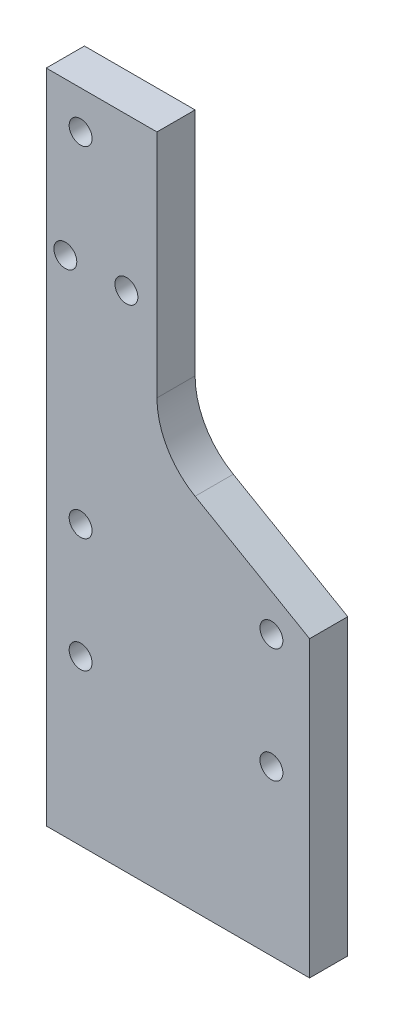
ISO-10303-21;
HEADER;
FILE_DESCRIPTION(('STEP AP214'),'2;1');
FILE_NAME('part.step','',(''),(''),'','','');
FILE_SCHEMA(('AUTOMOTIVE_DESIGN { 1 0 10303 214 1 1 1 1 }'));
ENDSEC;
DATA;
#1=APPLICATION_CONTEXT('core data for automotive mechanical design processes');
#2=APPLICATION_PROTOCOL_DEFINITION('international standard','automotive_design',2000,#1);
#3=PRODUCT_CONTEXT('',#1,'mechanical');
#4=PRODUCT('Part','Part','',(#3));
#5=PRODUCT_RELATED_PRODUCT_CATEGORY('part','',(#4));
#6=PRODUCT_DEFINITION_FORMATION('','',#4);
#7=PRODUCT_DEFINITION_CONTEXT('part definition',#1,'design');
#8=PRODUCT_DEFINITION('design','',#6,#7);
#9=PRODUCT_DEFINITION_SHAPE('','',#8);
#10=(LENGTH_UNIT() NAMED_UNIT(*) SI_UNIT(.MILLI.,.METRE.));
#11=(NAMED_UNIT(*) PLANE_ANGLE_UNIT() SI_UNIT($,.RADIAN.));
#12=(NAMED_UNIT(*) SI_UNIT($,.STERADIAN.) SOLID_ANGLE_UNIT());
#13=UNCERTAINTY_MEASURE_WITH_UNIT(LENGTH_MEASURE(1.E-05),#10,'distance_accuracy_value','');
#14=(GEOMETRIC_REPRESENTATION_CONTEXT(3) GLOBAL_UNCERTAINTY_ASSIGNED_CONTEXT((#13)) GLOBAL_UNIT_ASSIGNED_CONTEXT((#10,
#11,#12)) REPRESENTATION_CONTEXT('',''));
#15=CARTESIAN_POINT('',(0.,0.,0.));
#16=DIRECTION('',(0.,0.,1.));
#17=DIRECTION('',(1.,0.,0.));
#18=AXIS2_PLACEMENT_3D('',#15,#16,#17);
#19=CARTESIAN_POINT('',(-20.,128.641016151377,10.));
#20=DIRECTION('',(0.,0.,1.));
#21=DIRECTION('',(1.,0.,0.));
#22=AXIS2_PLACEMENT_3D('',#19,#20,#21);
#23=PLANE('',#22);
#24=DIRECTION('',(-1.,0.,0.));
#25=VECTOR('',#24,1.);
#26=CARTESIAN_POINT('',(-69.0000000000001,17.,10.0000000000001));
#27=LINE('',#26,#25);
#28=CARTESIAN_POINT('',(0.,17.,10.0000000000002));
#29=VERTEX_POINT('',#28);
#30=CARTESIAN_POINT('',(-69.0000000000001,17.,10.0000000000001));
#31=VERTEX_POINT('',#30);
#32=EDGE_CURVE('E47',#29,#31,#27,.T.);
#33=ORIENTED_EDGE('',*,*,#32,.F.);
#34=DIRECTION('',(0.,1.,0.));
#35=VECTOR('',#34,1.);
#36=CARTESIAN_POINT('',(0.,94.,10.0000000000002));
#37=LINE('',#36,#35);
#38=CARTESIAN_POINT('',(0.,94.,10.0000000000002));
#39=VERTEX_POINT('',#38);
#40=EDGE_CURVE('E87',#29,#39,#37,.T.);
#41=ORIENTED_EDGE('',*,*,#40,.T.);
#42=DIRECTION('',(-0.866025403784441,0.499999999999998,0.));
#43=VECTOR('',#42,1.);
#44=CARTESIAN_POINT('',(-29.9999999999999,111.320508075689,10.0000000000002));
#45=LINE('',#44,#43);
#46=CARTESIAN_POINT('',(-30.,111.320508075689,10.0000000000002));
#47=VERTEX_POINT('',#46);
#48=EDGE_CURVE('E101',#39,#47,#45,.T.);
#49=ORIENTED_EDGE('',*,*,#48,.T.);
#50=CARTESIAN_POINT('',(-20.,128.641016151377,10.));
#51=DIRECTION('',(0.,0.,-1.));
#52=DIRECTION('',(1.,0.,0.));
#53=AXIS2_PLACEMENT_3D('',#50,#51,#52);
#54=CIRCLE('',#53,20.);
#55=CARTESIAN_POINT('',(-39.9999999999998,128.641016151377,10.0000000000001));
#56=VERTEX_POINT('',#55);
#57=EDGE_CURVE('E95',#47,#56,#54,.T.);
#58=ORIENTED_EDGE('',*,*,#57,.T.);
#59=DIRECTION('',(0.,1.,0.));
#60=VECTOR('',#59,1.);
#61=CARTESIAN_POINT('',(-39.9999999999998,189.,10.0000000000001));
#62=LINE('',#61,#60);
#63=CARTESIAN_POINT('',(-39.9999999999998,189.,10.0000000000001));
#64=VERTEX_POINT('',#63);
#65=EDGE_CURVE('E99',#56,#64,#62,.T.);
#66=ORIENTED_EDGE('',*,*,#65,.T.);
#67=DIRECTION('',(-1.,0.,0.));
#68=VECTOR('',#67,1.);
#69=CARTESIAN_POINT('',(-69.0000000000001,189.,10.0000000000001));
#70=LINE('',#69,#68);
#71=CARTESIAN_POINT('',(-69.0000000000001,189.,10.0000000000001));
#72=VERTEX_POINT('',#71);
#73=EDGE_CURVE('E56',#64,#72,#70,.T.);
#74=ORIENTED_EDGE('',*,*,#73,.T.);
#75=DIRECTION('',(0.,-1.,0.));
#76=VECTOR('',#75,1.);
#77=CARTESIAN_POINT('',(-69.0000000000001,0.,10.0000000000001));
#78=LINE('',#77,#76);
#79=EDGE_CURVE('E117',#72,#31,#78,.T.);
#80=ORIENTED_EDGE('',*,*,#79,.T.);
#81=EDGE_LOOP('',(#33,#41,#49,#58,#66,#74,#80));
#82=FACE_BOUND('',#81,.T.);
#83=CARTESIAN_POINT('',(-48.,149.,10.0000000000001));
#84=DIRECTION('',(0.,0.,1.));
#85=DIRECTION('',(1.,0.,0.));
#86=AXIS2_PLACEMENT_3D('',#83,#84,#85);
#87=CIRCLE('',#86,3.);
#88=CARTESIAN_POINT('',(-45.,149.,10.0000000000001));
#89=VERTEX_POINT('',#88);
#90=EDGE_CURVE('E184',#89,#89,#87,.T.);
#91=ORIENTED_EDGE('',*,*,#90,.F.);
#92=EDGE_LOOP('',(#91));
#93=FACE_BOUND('',#92,.T.);
#94=CARTESIAN_POINT('',(-10.,90.,9.99999999999995));
#95=DIRECTION('',(0.,0.,1.));
#96=DIRECTION('',(1.,0.,0.));
#97=AXIS2_PLACEMENT_3D('',#94,#95,#96);
#98=CIRCLE('',#97,3.);
#99=CARTESIAN_POINT('',(-7.00000000000001,90.,9.99999999999995));
#100=VERTEX_POINT('',#99);
#101=EDGE_CURVE('E172',#100,#100,#98,.T.);
#102=ORIENTED_EDGE('',*,*,#101,.F.);
#103=EDGE_LOOP('',(#102));
#104=FACE_BOUND('',#103,.T.);
#105=CARTESIAN_POINT('',(-10.,59.9999999999999,9.99999999999995));
#106=DIRECTION('',(0.,0.,1.));
#107=DIRECTION('',(1.,0.,0.));
#108=AXIS2_PLACEMENT_3D('',#105,#106,#107);
#109=CIRCLE('',#108,3.);
#110=CARTESIAN_POINT('',(-7.00000000000001,59.9999999999999,9.99999999999995));
#111=VERTEX_POINT('',#110);
#112=EDGE_CURVE('E160',#111,#111,#109,.T.);
#113=ORIENTED_EDGE('',*,*,#112,.F.);
#114=EDGE_LOOP('',(#113));
#115=FACE_BOUND('',#114,.T.);
#116=CARTESIAN_POINT('',(-59.9999999999999,59.9999999999999,10.0000000000002));
#117=DIRECTION('',(0.,0.,1.));
#118=DIRECTION('',(1.,0.,0.));
#119=AXIS2_PLACEMENT_3D('',#116,#117,#118);
#120=CIRCLE('',#119,3.);
#121=CARTESIAN_POINT('',(-56.9999999999999,59.9999999999999,10.0000000000002));
#122=VERTEX_POINT('',#121);
#123=EDGE_CURVE('E126',#122,#122,#120,.T.);
#124=ORIENTED_EDGE('',*,*,#123,.F.);
#125=EDGE_LOOP('',(#124));
#126=FACE_BOUND('',#125,.T.);
#127=CARTESIAN_POINT('',(-59.9999999999999,90.,10.0000000000002));
#128=DIRECTION('',(0.,0.,1.));
#129=DIRECTION('',(1.,0.,0.));
#130=AXIS2_PLACEMENT_3D('',#127,#128,#129);
#131=CIRCLE('',#130,3.);
#132=CARTESIAN_POINT('',(-56.9999999999999,90.,10.0000000000002));
#133=VERTEX_POINT('',#132);
#134=EDGE_CURVE('E166',#133,#133,#131,.T.);
#135=ORIENTED_EDGE('',*,*,#134,.F.);
#136=EDGE_LOOP('',(#135));
#137=FACE_BOUND('',#136,.T.);
#138=CARTESIAN_POINT('',(-64.,149.,10.));
#139=DIRECTION('',(0.,0.,1.));
#140=DIRECTION('',(1.,0.,0.));
#141=AXIS2_PLACEMENT_3D('',#138,#139,#140);
#142=CIRCLE('',#141,3.);
#143=CARTESIAN_POINT('',(-61.,149.,10.));
#144=VERTEX_POINT('',#143);
#145=EDGE_CURVE('E178',#144,#144,#142,.T.);
#146=ORIENTED_EDGE('',*,*,#145,.F.);
#147=EDGE_LOOP('',(#146));
#148=FACE_BOUND('',#147,.T.);
#149=CARTESIAN_POINT('',(-59.9999999999999,179.,10.0000000000002));
#150=DIRECTION('',(0.,0.,1.));
#151=DIRECTION('',(1.,0.,0.));
#152=AXIS2_PLACEMENT_3D('',#149,#150,#151);
#153=CIRCLE('',#152,3.);
#154=CARTESIAN_POINT('',(-56.9999999999999,179.,10.0000000000002));
#155=VERTEX_POINT('',#154);
#156=EDGE_CURVE('E190',#155,#155,#153,.T.);
#157=ORIENTED_EDGE('',*,*,#156,.F.);
#158=EDGE_LOOP('',(#157));
#159=FACE_BOUND('',#158,.T.);
#160=ADVANCED_FACE('F32',(#82,#93,#104,#115,#126,#137,#148,#159),#23,.T.);
#161=CARTESIAN_POINT('',(-19.9999999999998,128.641016151377,1.11022302462516E-13));
#162=DIRECTION('',(0.,0.,1.));
#163=DIRECTION('',(1.,0.,0.));
#164=AXIS2_PLACEMENT_3D('',#161,#162,#163);
#165=PLANE('',#164);
#166=CARTESIAN_POINT('',(-48.,149.,1.11022302462516E-13));
#167=DIRECTION('',(0.,0.,1.));
#168=DIRECTION('',(1.,0.,0.));
#169=AXIS2_PLACEMENT_3D('',#166,#167,#168);
#170=CIRCLE('',#169,3.);
#171=CARTESIAN_POINT('',(-45.,149.,1.11022302462516E-13));
#172=VERTEX_POINT('',#171);
#173=EDGE_CURVE('E187',#172,#172,#170,.T.);
#174=ORIENTED_EDGE('',*,*,#173,.T.);
#175=EDGE_LOOP('',(#174));
#176=FACE_BOUND('',#175,.T.);
#177=CARTESIAN_POINT('',(-10.,90.,1.11022302462516E-13));
#178=DIRECTION('',(0.,0.,1.));
#179=DIRECTION('',(1.,0.,0.));
#180=AXIS2_PLACEMENT_3D('',#177,#178,#179);
#181=CIRCLE('',#180,3.);
#182=CARTESIAN_POINT('',(-7.00000000000001,90.,1.11022302462516E-13));
#183=VERTEX_POINT('',#182);
#184=EDGE_CURVE('E175',#183,#183,#181,.T.);
#185=ORIENTED_EDGE('',*,*,#184,.T.);
#186=EDGE_LOOP('',(#185));
#187=FACE_BOUND('',#186,.T.);
#188=CARTESIAN_POINT('',(-10.,60.,1.66533453693773E-13));
#189=DIRECTION('',(0.,0.,1.));
#190=DIRECTION('',(1.,0.,0.));
#191=AXIS2_PLACEMENT_3D('',#188,#189,#190);
#192=CIRCLE('',#191,3.);
#193=CARTESIAN_POINT('',(-7.00000000000002,60.,1.66533453693773E-13));
#194=VERTEX_POINT('',#193);
#195=EDGE_CURVE('E163',#194,#194,#192,.T.);
#196=ORIENTED_EDGE('',*,*,#195,.T.);
#197=EDGE_LOOP('',(#196));
#198=FACE_BOUND('',#197,.T.);
#199=DIRECTION('',(0.,1.,0.));
#200=VECTOR('',#199,1.);
#201=CARTESIAN_POINT('',(0.,94.,0.));
#202=LINE('',#201,#200);
#203=CARTESIAN_POINT('',(0.,17.,0.));
#204=VERTEX_POINT('',#203);
#205=CARTESIAN_POINT('',(0.,94.,0.));
#206=VERTEX_POINT('',#205);
#207=EDGE_CURVE('E123',#204,#206,#202,.T.);
#208=ORIENTED_EDGE('',*,*,#207,.F.);
#209=DIRECTION('',(-1.,0.,0.));
#210=VECTOR('',#209,1.);
#211=CARTESIAN_POINT('',(-69.,17.,0.));
#212=LINE('',#211,#210);
#213=CARTESIAN_POINT('',(-69.,17.,0.));
#214=VERTEX_POINT('',#213);
#215=EDGE_CURVE('E149',#204,#214,#212,.T.);
#216=ORIENTED_EDGE('',*,*,#215,.T.);
#217=DIRECTION('',(0.,-1.,0.));
#218=VECTOR('',#217,1.);
#219=CARTESIAN_POINT('',(-69.,0.,0.));
#220=LINE('',#219,#218);
#221=CARTESIAN_POINT('',(-69.,189.,0.));
#222=VERTEX_POINT('',#221);
#223=EDGE_CURVE('E132',#222,#214,#220,.T.);
#224=ORIENTED_EDGE('',*,*,#223,.F.);
#225=DIRECTION('',(-1.,0.,0.));
#226=VECTOR('',#225,1.);
#227=CARTESIAN_POINT('',(-69.,189.,0.));
#228=LINE('',#227,#226);
#229=CARTESIAN_POINT('',(-39.9999999999998,189.,2.22044604925031E-13));
#230=VERTEX_POINT('',#229);
#231=EDGE_CURVE('E80',#230,#222,#228,.T.);
#232=ORIENTED_EDGE('',*,*,#231,.F.);
#233=DIRECTION('',(0.,1.,0.));
#234=VECTOR('',#233,1.);
#235=CARTESIAN_POINT('',(-39.9999999999998,189.,2.22044604925031E-13));
#236=LINE('',#235,#234);
#237=CARTESIAN_POINT('',(-39.9999999999998,128.641016151377,2.22044604925031E-13));
#238=VERTEX_POINT('',#237);
#239=EDGE_CURVE('E129',#238,#230,#236,.T.);
#240=ORIENTED_EDGE('',*,*,#239,.F.);
#241=CARTESIAN_POINT('',(-19.9999999999998,128.641016151377,1.11022302462516E-13));
#242=DIRECTION('',(0.,0.,-1.));
#243=DIRECTION('',(1.,0.,0.));
#244=AXIS2_PLACEMENT_3D('',#241,#242,#243);
#245=CIRCLE('',#244,20.);
#246=CARTESIAN_POINT('',(-29.9999999999997,111.320508075689,1.66533453693773E-13));
#247=VERTEX_POINT('',#246);
#248=EDGE_CURVE('E110',#247,#238,#245,.T.);
#249=ORIENTED_EDGE('',*,*,#248,.F.);
#250=DIRECTION('',(-0.866025403784441,0.499999999999998,0.));
#251=VECTOR('',#250,1.);
#252=CARTESIAN_POINT('',(-29.9999999999997,111.320508075689,1.66533453693773E-13));
#253=LINE('',#252,#251);
#254=EDGE_CURVE('E125',#206,#247,#253,.T.);
#255=ORIENTED_EDGE('',*,*,#254,.F.);
#256=EDGE_LOOP('',(#208,#216,#224,#232,#240,#249,#255));
#257=FACE_BOUND('',#256,.T.);
#258=CARTESIAN_POINT('',(-60.,60.,1.66533453693773E-13));
#259=DIRECTION('',(0.,0.,1.));
#260=DIRECTION('',(1.,0.,0.));
#261=AXIS2_PLACEMENT_3D('',#258,#259,#260);
#262=CIRCLE('',#261,3.);
#263=CARTESIAN_POINT('',(-57.,60.,1.66533453693773E-13));
#264=VERTEX_POINT('',#263);
#265=EDGE_CURVE('E157',#264,#264,#262,.T.);
#266=ORIENTED_EDGE('',*,*,#265,.T.);
#267=EDGE_LOOP('',(#266));
#268=FACE_BOUND('',#267,.T.);
#269=CARTESIAN_POINT('',(-60.,90.,1.11022302462516E-13));
#270=DIRECTION('',(0.,0.,1.));
#271=DIRECTION('',(1.,0.,0.));
#272=AXIS2_PLACEMENT_3D('',#269,#270,#271);
#273=CIRCLE('',#272,3.);
#274=CARTESIAN_POINT('',(-57.,90.,1.11022302462516E-13));
#275=VERTEX_POINT('',#274);
#276=EDGE_CURVE('E169',#275,#275,#273,.T.);
#277=ORIENTED_EDGE('',*,*,#276,.T.);
#278=EDGE_LOOP('',(#277));
#279=FACE_BOUND('',#278,.T.);
#280=CARTESIAN_POINT('',(-64.,149.,1.11022302462516E-13));
#281=DIRECTION('',(0.,0.,1.));
#282=DIRECTION('',(1.,0.,0.));
#283=AXIS2_PLACEMENT_3D('',#280,#281,#282);
#284=CIRCLE('',#283,3.);
#285=CARTESIAN_POINT('',(-61.,149.,1.11022302462516E-13));
#286=VERTEX_POINT('',#285);
#287=EDGE_CURVE('E181',#286,#286,#284,.T.);
#288=ORIENTED_EDGE('',*,*,#287,.T.);
#289=EDGE_LOOP('',(#288));
#290=FACE_BOUND('',#289,.T.);
#291=CARTESIAN_POINT('',(-60.,179.,1.66533453693773E-13));
#292=DIRECTION('',(0.,0.,1.));
#293=DIRECTION('',(1.,0.,0.));
#294=AXIS2_PLACEMENT_3D('',#291,#292,#293);
#295=CIRCLE('',#294,3.);
#296=CARTESIAN_POINT('',(-57.,179.,1.66533453693773E-13));
#297=VERTEX_POINT('',#296);
#298=EDGE_CURVE('E193',#297,#297,#295,.T.);
#299=ORIENTED_EDGE('',*,*,#298,.T.);
#300=EDGE_LOOP('',(#299));
#301=FACE_BOUND('',#300,.T.);
#302=ADVANCED_FACE('F140',(#176,#187,#198,#257,#268,#279,#290,#301),#165,.F.);
#303=CARTESIAN_POINT('',(0.,94.,10.0000000000002));
#304=DIRECTION('',(-1.,0.,0.));
#305=DIRECTION('',(0.,-1.,0.));
#306=AXIS2_PLACEMENT_3D('',#303,#304,#305);
#307=PLANE('',#306);
#308=ORIENTED_EDGE('',*,*,#40,.F.);
#309=DIRECTION('',(0.,0.,1.));
#310=VECTOR('',#309,1.);
#311=CARTESIAN_POINT('',(0.,17.,0.));
#312=LINE('',#311,#310);
#313=EDGE_CURVE('E154',#204,#29,#312,.T.);
#314=ORIENTED_EDGE('',*,*,#313,.F.);
#315=ORIENTED_EDGE('',*,*,#207,.T.);
#316=DIRECTION('',(0.,0.,-1.));
#317=VECTOR('',#316,1.);
#318=CARTESIAN_POINT('',(0.,94.,10.0000000000002));
#319=LINE('',#318,#317);
#320=EDGE_CURVE('E11',#39,#206,#319,.T.);
#321=ORIENTED_EDGE('',*,*,#320,.F.);
#322=EDGE_LOOP('',(#308,#314,#315,#321));
#323=FACE_BOUND('',#322,.T.);
#324=ADVANCED_FACE('F34',(#323),#307,.F.);
#325=CARTESIAN_POINT('',(-29.9999999999999,111.320508075689,10.0000000000002));
#326=DIRECTION('',(-0.499999999999998,-0.86602540378444,0.));
#327=DIRECTION('',(0.866025403784441,-0.499999999999998,0.));
#328=AXIS2_PLACEMENT_3D('',#325,#326,#327);
#329=PLANE('',#328);
#330=ORIENTED_EDGE('',*,*,#254,.T.);
#331=DIRECTION('',(0.,0.,-1.));
#332=VECTOR('',#331,1.);
#333=CARTESIAN_POINT('',(-30.,111.320508075689,10.0000000000002));
#334=LINE('',#333,#332);
#335=EDGE_CURVE('E40',#47,#247,#334,.T.);
#336=ORIENTED_EDGE('',*,*,#335,.F.);
#337=ORIENTED_EDGE('',*,*,#48,.F.);
#338=ORIENTED_EDGE('',*,*,#320,.T.);
#339=EDGE_LOOP('',(#330,#336,#337,#338));
#340=FACE_BOUND('',#339,.T.);
#341=ADVANCED_FACE('F231',(#340),#329,.F.);
#342=CARTESIAN_POINT('',(-20.,128.641016151377,10.));
#343=DIRECTION('',(0.,0.,-1.));
#344=DIRECTION('',(-1.,0.,0.));
#345=AXIS2_PLACEMENT_3D('',#342,#343,#344);
#346=CYLINDRICAL_SURFACE('',#345,20.);
#347=ORIENTED_EDGE('',*,*,#248,.T.);
#348=DIRECTION('',(0.,0.,-1.));
#349=VECTOR('',#348,1.);
#350=CARTESIAN_POINT('',(-39.9999999999998,128.641016151377,10.0000000000001));
#351=LINE('',#350,#349);
#352=EDGE_CURVE('E107',#56,#238,#351,.T.);
#353=ORIENTED_EDGE('',*,*,#352,.F.);
#354=ORIENTED_EDGE('',*,*,#57,.F.);
#355=ORIENTED_EDGE('',*,*,#335,.T.);
#356=EDGE_LOOP('',(#347,#353,#354,#355));
#357=FACE_BOUND('',#356,.T.);
#358=ADVANCED_FACE('F108',(#357),#346,.F.);
#359=CARTESIAN_POINT('',(-39.9999999999998,189.,10.0000000000001));
#360=DIRECTION('',(-1.,0.,0.));
#361=DIRECTION('',(0.,0.,1.));
#362=AXIS2_PLACEMENT_3D('',#359,#360,#361);
#363=PLANE('',#362);
#364=ORIENTED_EDGE('',*,*,#239,.T.);
#365=DIRECTION('',(0.,0.,-1.));
#366=VECTOR('',#365,1.);
#367=CARTESIAN_POINT('',(-39.9999999999998,189.,10.0000000000001));
#368=LINE('',#367,#366);
#369=EDGE_CURVE('E113',#64,#230,#368,.T.);
#370=ORIENTED_EDGE('',*,*,#369,.F.);
#371=ORIENTED_EDGE('',*,*,#65,.F.);
#372=ORIENTED_EDGE('',*,*,#352,.T.);
#373=EDGE_LOOP('',(#364,#370,#371,#372));
#374=FACE_BOUND('',#373,.T.);
#375=ADVANCED_FACE('F115',(#374),#363,.F.);
#376=CARTESIAN_POINT('',(-69.0000000000001,189.,10.0000000000001));
#377=DIRECTION('',(0.,-1.,0.));
#378=DIRECTION('',(0.,0.,-1.));
#379=AXIS2_PLACEMENT_3D('',#376,#377,#378);
#380=PLANE('',#379);
#381=ORIENTED_EDGE('',*,*,#231,.T.);
#382=DIRECTION('',(0.,0.,-1.));
#383=VECTOR('',#382,1.);
#384=CARTESIAN_POINT('',(-69.0000000000001,189.,10.0000000000001));
#385=LINE('',#384,#383);
#386=EDGE_CURVE('E122',#72,#222,#385,.T.);
#387=ORIENTED_EDGE('',*,*,#386,.F.);
#388=ORIENTED_EDGE('',*,*,#73,.F.);
#389=ORIENTED_EDGE('',*,*,#369,.T.);
#390=EDGE_LOOP('',(#381,#387,#388,#389));
#391=FACE_BOUND('',#390,.T.);
#392=ADVANCED_FACE('F143',(#391),#380,.F.);
#393=CARTESIAN_POINT('',(-69.0000000000001,0.,10.0000000000001));
#394=DIRECTION('',(1.,0.,0.));
#395=DIRECTION('',(0.,0.,-1.));
#396=AXIS2_PLACEMENT_3D('',#393,#394,#395);
#397=PLANE('',#396);
#398=ORIENTED_EDGE('',*,*,#223,.T.);
#399=DIRECTION('',(0.,0.,1.));
#400=VECTOR('',#399,1.);
#401=CARTESIAN_POINT('',(-69.,17.,0.));
#402=LINE('',#401,#400);
#403=EDGE_CURVE('E147',#214,#31,#402,.T.);
#404=ORIENTED_EDGE('',*,*,#403,.T.);
#405=ORIENTED_EDGE('',*,*,#79,.F.);
#406=ORIENTED_EDGE('',*,*,#386,.T.);
#407=EDGE_LOOP('',(#398,#404,#405,#406));
#408=FACE_BOUND('',#407,.T.);
#409=ADVANCED_FACE('F146',(#408),#397,.F.);
#410=CARTESIAN_POINT('',(-59.9999999999999,59.9999999999999,10.0000000000002));
#411=DIRECTION('',(0.,0.,-1.));
#412=DIRECTION('',(-1.,0.,0.));
#413=AXIS2_PLACEMENT_3D('',#410,#411,#412);
#414=CYLINDRICAL_SURFACE('',#413,3.);
#415=ORIENTED_EDGE('',*,*,#123,.T.);
#416=EDGE_LOOP('',(#415));
#417=FACE_BOUND('',#416,.T.);
#418=ORIENTED_EDGE('',*,*,#265,.F.);
#419=EDGE_LOOP('',(#418));
#420=FACE_BOUND('',#419,.T.);
#421=ADVANCED_FACE('F221',(#417,#420),#414,.F.);
#422=CARTESIAN_POINT('',(-10.,59.9999999999999,9.99999999999995));
#423=DIRECTION('',(0.,0.,-1.));
#424=DIRECTION('',(-1.,0.,0.));
#425=AXIS2_PLACEMENT_3D('',#422,#423,#424);
#426=CYLINDRICAL_SURFACE('',#425,3.);
#427=ORIENTED_EDGE('',*,*,#112,.T.);
#428=EDGE_LOOP('',(#427));
#429=FACE_BOUND('',#428,.T.);
#430=ORIENTED_EDGE('',*,*,#195,.F.);
#431=EDGE_LOOP('',(#430));
#432=FACE_BOUND('',#431,.T.);
#433=ADVANCED_FACE('F282',(#429,#432),#426,.F.);
#434=CARTESIAN_POINT('',(-59.9999999999999,90.,10.0000000000002));
#435=DIRECTION('',(0.,0.,-1.));
#436=DIRECTION('',(-1.,0.,0.));
#437=AXIS2_PLACEMENT_3D('',#434,#435,#436);
#438=CYLINDRICAL_SURFACE('',#437,3.);
#439=ORIENTED_EDGE('',*,*,#134,.T.);
#440=EDGE_LOOP('',(#439));
#441=FACE_BOUND('',#440,.T.);
#442=ORIENTED_EDGE('',*,*,#276,.F.);
#443=EDGE_LOOP('',(#442));
#444=FACE_BOUND('',#443,.T.);
#445=ADVANCED_FACE('F290',(#441,#444),#438,.F.);
#446=CARTESIAN_POINT('',(-10.,90.,9.99999999999995));
#447=DIRECTION('',(0.,0.,-1.));
#448=DIRECTION('',(-1.,0.,0.));
#449=AXIS2_PLACEMENT_3D('',#446,#447,#448);
#450=CYLINDRICAL_SURFACE('',#449,3.);
#451=ORIENTED_EDGE('',*,*,#101,.T.);
#452=EDGE_LOOP('',(#451));
#453=FACE_BOUND('',#452,.T.);
#454=ORIENTED_EDGE('',*,*,#184,.F.);
#455=EDGE_LOOP('',(#454));
#456=FACE_BOUND('',#455,.T.);
#457=ADVANCED_FACE('F298',(#453,#456),#450,.F.);
#458=CARTESIAN_POINT('',(-64.,149.,10.));
#459=DIRECTION('',(0.,0.,-1.));
#460=DIRECTION('',(-1.,0.,0.));
#461=AXIS2_PLACEMENT_3D('',#458,#459,#460);
#462=CYLINDRICAL_SURFACE('',#461,3.);
#463=ORIENTED_EDGE('',*,*,#145,.T.);
#464=EDGE_LOOP('',(#463));
#465=FACE_BOUND('',#464,.T.);
#466=ORIENTED_EDGE('',*,*,#287,.F.);
#467=EDGE_LOOP('',(#466));
#468=FACE_BOUND('',#467,.T.);
#469=ADVANCED_FACE('F307',(#465,#468),#462,.F.);
#470=CARTESIAN_POINT('',(-48.,149.,10.0000000000001));
#471=DIRECTION('',(0.,0.,-1.));
#472=DIRECTION('',(-1.,0.,0.));
#473=AXIS2_PLACEMENT_3D('',#470,#471,#472);
#474=CYLINDRICAL_SURFACE('',#473,3.);
#475=ORIENTED_EDGE('',*,*,#90,.T.);
#476=EDGE_LOOP('',(#475));
#477=FACE_BOUND('',#476,.T.);
#478=ORIENTED_EDGE('',*,*,#173,.F.);
#479=EDGE_LOOP('',(#478));
#480=FACE_BOUND('',#479,.T.);
#481=ADVANCED_FACE('F210',(#477,#480),#474,.F.);
#482=CARTESIAN_POINT('',(-59.9999999999999,179.,10.0000000000002));
#483=DIRECTION('',(0.,0.,-1.));
#484=DIRECTION('',(-1.,0.,0.));
#485=AXIS2_PLACEMENT_3D('',#482,#483,#484);
#486=CYLINDRICAL_SURFACE('',#485,3.);
#487=ORIENTED_EDGE('',*,*,#156,.T.);
#488=EDGE_LOOP('',(#487));
#489=FACE_BOUND('',#488,.T.);
#490=ORIENTED_EDGE('',*,*,#298,.F.);
#491=EDGE_LOOP('',(#490));
#492=FACE_BOUND('',#491,.T.);
#493=ADVANCED_FACE('F205',(#489,#492),#486,.F.);
#494=CARTESIAN_POINT('',(-69.,17.,0.));
#495=DIRECTION('',(0.,1.,0.));
#496=DIRECTION('',(0.,0.,1.));
#497=AXIS2_PLACEMENT_3D('',#494,#495,#496);
#498=PLANE('',#497);
#499=ORIENTED_EDGE('',*,*,#32,.T.);
#500=ORIENTED_EDGE('',*,*,#403,.F.);
#501=ORIENTED_EDGE('',*,*,#215,.F.);
#502=ORIENTED_EDGE('',*,*,#313,.T.);
#503=EDGE_LOOP('',(#499,#500,#501,#502));
#504=FACE_BOUND('',#503,.T.);
#505=ADVANCED_FACE('F202',(#504),#498,.F.);
#506=CLOSED_SHELL('',(#160,#302,#324,#341,#358,#375,#392,#409,#421,#433,#445,#457,#469,#481,
#493,#505));
#507=MANIFOLD_SOLID_BREP('B2',#506);
#508=ADVANCED_BREP_SHAPE_REPRESENTATION('',(#18,#507),#14);
#509=SHAPE_DEFINITION_REPRESENTATION(#9,#508);
ENDSEC;
END-ISO-10303-21;
